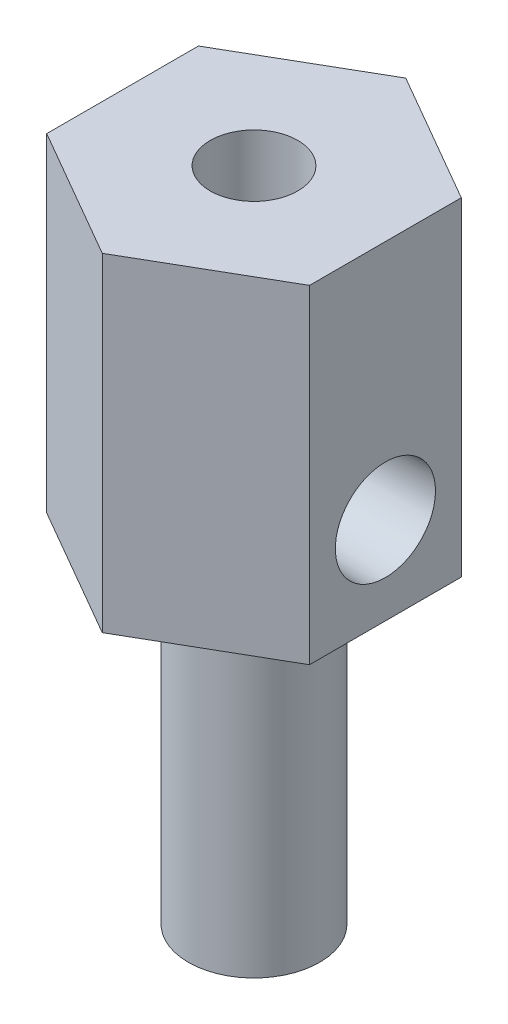
ISO-10303-21;
HEADER;
FILE_DESCRIPTION(('STEP AP214'),'2;1');
FILE_NAME('part.step','',(''),(''),'','','');
FILE_SCHEMA(('AUTOMOTIVE_DESIGN { 1 0 10303 214 1 1 1 1 }'));
ENDSEC;
DATA;
#1=APPLICATION_CONTEXT('core data for automotive mechanical design processes');
#2=APPLICATION_PROTOCOL_DEFINITION('international standard','automotive_design',2000,#1);
#3=PRODUCT_CONTEXT('',#1,'mechanical');
#4=PRODUCT('Part','Part','',(#3));
#5=PRODUCT_RELATED_PRODUCT_CATEGORY('part','',(#4));
#6=PRODUCT_DEFINITION_FORMATION('','',#4);
#7=PRODUCT_DEFINITION_CONTEXT('part definition',#1,'design');
#8=PRODUCT_DEFINITION('design','',#6,#7);
#9=PRODUCT_DEFINITION_SHAPE('','',#8);
#10=(LENGTH_UNIT() NAMED_UNIT(*) SI_UNIT(.MILLI.,.METRE.));
#11=(NAMED_UNIT(*) PLANE_ANGLE_UNIT() SI_UNIT($,.RADIAN.));
#12=(NAMED_UNIT(*) SI_UNIT($,.STERADIAN.) SOLID_ANGLE_UNIT());
#13=UNCERTAINTY_MEASURE_WITH_UNIT(LENGTH_MEASURE(1.E-05),#10,'distance_accuracy_value','');
#14=(GEOMETRIC_REPRESENTATION_CONTEXT(3) GLOBAL_UNCERTAINTY_ASSIGNED_CONTEXT((#13)) GLOBAL_UNIT_ASSIGNED_CONTEXT((#10,
#11,#12)) REPRESENTATION_CONTEXT('',''));
#15=CARTESIAN_POINT('',(0.,0.,0.));
#16=DIRECTION('',(0.,0.,1.));
#17=DIRECTION('',(1.,0.,0.));
#18=AXIS2_PLACEMENT_3D('',#15,#16,#17);
#19=CARTESIAN_POINT('',(0.,30.,0.));
#20=DIRECTION('',(0.,-1.,0.));
#21=DIRECTION('',(0.,0.,-1.));
#22=AXIS2_PLACEMENT_3D('',#19,#20,#21);
#23=CYLINDRICAL_SURFACE('',#22,6.);
#24=CARTESIAN_POINT('',(0.,30.,0.));
#25=DIRECTION('',(0.,1.,0.));
#26=DIRECTION('',(0.,0.,1.));
#27=AXIS2_PLACEMENT_3D('',#24,#25,#26);
#28=CIRCLE('',#27,6.);
#29=CARTESIAN_POINT('',(0.,30.,6.));
#30=VERTEX_POINT('',#29);
#31=EDGE_CURVE('E11',#30,#30,#28,.T.);
#32=ORIENTED_EDGE('',*,*,#31,.F.);
#33=EDGE_LOOP('',(#32));
#34=FACE_BOUND('',#33,.T.);
#35=CARTESIAN_POINT('',(0.,0.,0.));
#36=DIRECTION('',(0.,1.,0.));
#37=DIRECTION('',(0.,0.,1.));
#38=AXIS2_PLACEMENT_3D('',#35,#36,#37);
#39=CIRCLE('',#38,6.);
#40=CARTESIAN_POINT('',(0.,0.,6.));
#41=VERTEX_POINT('',#40);
#42=EDGE_CURVE('E20',#41,#41,#39,.T.);
#43=ORIENTED_EDGE('',*,*,#42,.T.);
#44=EDGE_LOOP('',(#43));
#45=FACE_BOUND('',#44,.T.);
#46=ADVANCED_FACE('F17',(#34,#45),#23,.T.);
#47=CARTESIAN_POINT('',(0.,0.,0.));
#48=DIRECTION('',(0.,1.,0.));
#49=DIRECTION('',(0.,0.,1.));
#50=AXIS2_PLACEMENT_3D('',#47,#48,#49);
#51=PLANE('',#50);
#52=ORIENTED_EDGE('',*,*,#42,.F.);
#53=EDGE_LOOP('',(#52));
#54=FACE_BOUND('',#53,.T.);
#55=ADVANCED_FACE('F129',(#54),#51,.F.);
#56=CARTESIAN_POINT('',(0.,30.,0.));
#57=DIRECTION('',(0.,1.,0.));
#58=DIRECTION('',(0.,0.,1.));
#59=AXIS2_PLACEMENT_3D('',#56,#57,#58);
#60=PLANE('',#59);
#61=DIRECTION('',(-0.866025403784439,0.,-0.5));
#62=VECTOR('',#61,1.);
#63=CARTESIAN_POINT('',(12.,30.,-6.92820323027551));
#64=LINE('',#63,#62);
#65=CARTESIAN_POINT('',(12.,30.,-6.92820323027551));
#66=VERTEX_POINT('',#65);
#67=CARTESIAN_POINT('',(0.,30.,-13.856406460551));
#68=VERTEX_POINT('',#67);
#69=EDGE_CURVE('E105',#66,#68,#64,.T.);
#70=ORIENTED_EDGE('',*,*,#69,.F.);
#71=DIRECTION('',(0.,0.,-1.));
#72=VECTOR('',#71,1.);
#73=CARTESIAN_POINT('',(12.,30.,6.92820323027552));
#74=LINE('',#73,#72);
#75=CARTESIAN_POINT('',(12.,30.,6.92820323027552));
#76=VERTEX_POINT('',#75);
#77=EDGE_CURVE('E63',#76,#66,#74,.T.);
#78=ORIENTED_EDGE('',*,*,#77,.F.);
#79=DIRECTION('',(0.866025403784439,0.,-0.5));
#80=VECTOR('',#79,1.);
#81=CARTESIAN_POINT('',(0.,30.,13.856406460551));
#82=LINE('',#81,#80);
#83=CARTESIAN_POINT('',(0.,30.,13.856406460551));
#84=VERTEX_POINT('',#83);
#85=EDGE_CURVE('E57',#84,#76,#82,.T.);
#86=ORIENTED_EDGE('',*,*,#85,.F.);
#87=DIRECTION('',(0.866025403784439,0.,0.5));
#88=VECTOR('',#87,1.);
#89=CARTESIAN_POINT('',(-12.,30.,6.92820323027551));
#90=LINE('',#89,#88);
#91=CARTESIAN_POINT('',(-12.,30.,6.92820323027551));
#92=VERTEX_POINT('',#91);
#93=EDGE_CURVE('E95',#92,#84,#90,.T.);
#94=ORIENTED_EDGE('',*,*,#93,.F.);
#95=DIRECTION('',(0.,0.,1.));
#96=VECTOR('',#95,1.);
#97=CARTESIAN_POINT('',(-12.,30.,-6.92820323027551));
#98=LINE('',#97,#96);
#99=CARTESIAN_POINT('',(-12.,30.,-6.92820323027551));
#100=VERTEX_POINT('',#99);
#101=EDGE_CURVE('E111',#100,#92,#98,.T.);
#102=ORIENTED_EDGE('',*,*,#101,.F.);
#103=DIRECTION('',(-0.866025403784439,0.,0.5));
#104=VECTOR('',#103,1.);
#105=CARTESIAN_POINT('',(0.,30.,-13.856406460551));
#106=LINE('',#105,#104);
#107=EDGE_CURVE('E108',#68,#100,#106,.T.);
#108=ORIENTED_EDGE('',*,*,#107,.F.);
#109=EDGE_LOOP('',(#70,#78,#86,#94,#102,#108));
#110=FACE_BOUND('',#109,.T.);
#111=ORIENTED_EDGE('',*,*,#31,.T.);
#112=EDGE_LOOP('',(#111));
#113=FACE_BOUND('',#112,.T.);
#114=ADVANCED_FACE('F131',(#110,#113),#60,.F.);
#115=CARTESIAN_POINT('',(12.,60.,-6.92820323027551));
#116=DIRECTION('',(-0.5,0.,0.866025403784439));
#117=DIRECTION('',(0.866025403784439,0.,0.5));
#118=AXIS2_PLACEMENT_3D('',#115,#116,#117);
#119=PLANE('',#118);
#120=ORIENTED_EDGE('',*,*,#69,.T.);
#121=DIRECTION('',(0.,-1.,0.));
#122=VECTOR('',#121,1.);
#123=CARTESIAN_POINT('',(0.,60.,-13.856406460551));
#124=LINE('',#123,#122);
#125=CARTESIAN_POINT('',(0.,60.,-13.856406460551));
#126=VERTEX_POINT('',#125);
#127=EDGE_CURVE('E123',#126,#68,#124,.T.);
#128=ORIENTED_EDGE('',*,*,#127,.F.);
#129=DIRECTION('',(-0.866025403784439,0.,-0.5));
#130=VECTOR('',#129,1.);
#131=CARTESIAN_POINT('',(12.,60.,-6.92820323027551));
#132=LINE('',#131,#130);
#133=CARTESIAN_POINT('',(12.,60.,-6.92820323027551));
#134=VERTEX_POINT('',#133);
#135=EDGE_CURVE('E116',#134,#126,#132,.T.);
#136=ORIENTED_EDGE('',*,*,#135,.F.);
#137=DIRECTION('',(0.,-1.,0.));
#138=VECTOR('',#137,1.);
#139=CARTESIAN_POINT('',(12.,60.,-6.92820323027551));
#140=LINE('',#139,#138);
#141=EDGE_CURVE('E101',#134,#66,#140,.T.);
#142=ORIENTED_EDGE('',*,*,#141,.T.);
#143=EDGE_LOOP('',(#120,#128,#136,#142));
#144=FACE_BOUND('',#143,.T.);
#145=ADVANCED_FACE('F138',(#144),#119,.F.);
#146=CARTESIAN_POINT('',(0.,60.,-13.856406460551));
#147=DIRECTION('',(0.5,0.,0.866025403784439));
#148=DIRECTION('',(0.866025403784439,0.,-0.5));
#149=AXIS2_PLACEMENT_3D('',#146,#147,#148);
#150=PLANE('',#149);
#151=ORIENTED_EDGE('',*,*,#107,.T.);
#152=DIRECTION('',(0.,-1.,0.));
#153=VECTOR('',#152,1.);
#154=CARTESIAN_POINT('',(-12.,60.,-6.92820323027551));
#155=LINE('',#154,#153);
#156=CARTESIAN_POINT('',(-12.,60.,-6.92820323027551));
#157=VERTEX_POINT('',#156);
#158=EDGE_CURVE('E120',#157,#100,#155,.T.);
#159=ORIENTED_EDGE('',*,*,#158,.F.);
#160=DIRECTION('',(-0.866025403784439,0.,0.5));
#161=VECTOR('',#160,1.);
#162=CARTESIAN_POINT('',(0.,60.,-13.856406460551));
#163=LINE('',#162,#161);
#164=EDGE_CURVE('E72',#126,#157,#163,.T.);
#165=ORIENTED_EDGE('',*,*,#164,.F.);
#166=ORIENTED_EDGE('',*,*,#127,.T.);
#167=EDGE_LOOP('',(#151,#159,#165,#166));
#168=FACE_BOUND('',#167,.T.);
#169=ADVANCED_FACE('F145',(#168),#150,.F.);
#170=CARTESIAN_POINT('',(-12.,60.,-6.92820323027551));
#171=DIRECTION('',(1.,0.,0.));
#172=DIRECTION('',(0.,0.,-1.));
#173=AXIS2_PLACEMENT_3D('',#170,#171,#172);
#174=PLANE('',#173);
#175=ORIENTED_EDGE('',*,*,#101,.T.);
#176=DIRECTION('',(0.,-1.,0.));
#177=VECTOR('',#176,1.);
#178=CARTESIAN_POINT('',(-12.,60.,6.92820323027551));
#179=LINE('',#178,#177);
#180=CARTESIAN_POINT('',(-12.,60.,6.92820323027551));
#181=VERTEX_POINT('',#180);
#182=EDGE_CURVE('E96',#181,#92,#179,.T.);
#183=ORIENTED_EDGE('',*,*,#182,.F.);
#184=DIRECTION('',(0.,0.,1.));
#185=VECTOR('',#184,1.);
#186=CARTESIAN_POINT('',(-12.,60.,-6.92820323027551));
#187=LINE('',#186,#185);
#188=EDGE_CURVE('E87',#157,#181,#187,.T.);
#189=ORIENTED_EDGE('',*,*,#188,.F.);
#190=ORIENTED_EDGE('',*,*,#158,.T.);
#191=EDGE_LOOP('',(#175,#183,#189,#190));
#192=FACE_BOUND('',#191,.T.);
#193=ADVANCED_FACE('F149',(#192),#174,.F.);
#194=CARTESIAN_POINT('',(-12.,60.,6.92820323027551));
#195=DIRECTION('',(0.5,0.,-0.866025403784439));
#196=DIRECTION('',(-0.866025403784439,0.,-0.5));
#197=AXIS2_PLACEMENT_3D('',#194,#195,#196);
#198=PLANE('',#197);
#199=ORIENTED_EDGE('',*,*,#93,.T.);
#200=DIRECTION('',(0.,-1.,0.));
#201=VECTOR('',#200,1.);
#202=CARTESIAN_POINT('',(0.,60.,13.856406460551));
#203=LINE('',#202,#201);
#204=CARTESIAN_POINT('',(0.,60.,13.856406460551));
#205=VERTEX_POINT('',#204);
#206=EDGE_CURVE('E92',#205,#84,#203,.T.);
#207=ORIENTED_EDGE('',*,*,#206,.F.);
#208=DIRECTION('',(0.866025403784439,0.,0.5));
#209=VECTOR('',#208,1.);
#210=CARTESIAN_POINT('',(-12.,60.,6.92820323027551));
#211=LINE('',#210,#209);
#212=EDGE_CURVE('E81',#181,#205,#211,.T.);
#213=ORIENTED_EDGE('',*,*,#212,.F.);
#214=ORIENTED_EDGE('',*,*,#182,.T.);
#215=EDGE_LOOP('',(#199,#207,#213,#214));
#216=FACE_BOUND('',#215,.T.);
#217=ADVANCED_FACE('F93',(#216),#198,.F.);
#218=CARTESIAN_POINT('',(0.,60.,13.856406460551));
#219=DIRECTION('',(-0.5,0.,-0.866025403784439));
#220=DIRECTION('',(-0.866025403784439,0.,0.5));
#221=AXIS2_PLACEMENT_3D('',#218,#219,#220);
#222=PLANE('',#221);
#223=ORIENTED_EDGE('',*,*,#85,.T.);
#224=DIRECTION('',(0.,-1.,0.));
#225=VECTOR('',#224,1.);
#226=CARTESIAN_POINT('',(12.,60.,6.92820323027552));
#227=LINE('',#226,#225);
#228=CARTESIAN_POINT('',(12.,60.,6.92820323027552));
#229=VERTEX_POINT('',#228);
#230=EDGE_CURVE('E97',#229,#76,#227,.T.);
#231=ORIENTED_EDGE('',*,*,#230,.F.);
#232=DIRECTION('',(0.866025403784439,0.,-0.5));
#233=VECTOR('',#232,1.);
#234=CARTESIAN_POINT('',(0.,60.,13.856406460551));
#235=LINE('',#234,#233);
#236=EDGE_CURVE('E85',#205,#229,#235,.T.);
#237=ORIENTED_EDGE('',*,*,#236,.F.);
#238=ORIENTED_EDGE('',*,*,#206,.T.);
#239=EDGE_LOOP('',(#223,#231,#237,#238));
#240=FACE_BOUND('',#239,.T.);
#241=ADVANCED_FACE('F99',(#240),#222,.F.);
#242=CARTESIAN_POINT('',(12.,60.,6.92820323027552));
#243=DIRECTION('',(-1.,0.,0.));
#244=DIRECTION('',(0.,0.,1.));
#245=AXIS2_PLACEMENT_3D('',#242,#243,#244);
#246=PLANE('',#245);
#247=CARTESIAN_POINT('',(12.,38.,0.));
#248=DIRECTION('',(1.,0.,0.));
#249=DIRECTION('',(0.,0.,-1.));
#250=AXIS2_PLACEMENT_3D('',#247,#248,#249);
#251=CIRCLE('',#250,4.5735);
#252=CARTESIAN_POINT('',(12.,38.,-4.5735));
#253=VERTEX_POINT('',#252);
#254=EDGE_CURVE('E204',#253,#253,#251,.T.);
#255=ORIENTED_EDGE('',*,*,#254,.F.);
#256=EDGE_LOOP('',(#255));
#257=FACE_BOUND('',#256,.T.);
#258=ORIENTED_EDGE('',*,*,#77,.T.);
#259=ORIENTED_EDGE('',*,*,#141,.F.);
#260=DIRECTION('',(0.,0.,-1.));
#261=VECTOR('',#260,1.);
#262=CARTESIAN_POINT('',(12.,60.,6.92820323027552));
#263=LINE('',#262,#261);
#264=EDGE_CURVE('E33',#229,#134,#263,.T.);
#265=ORIENTED_EDGE('',*,*,#264,.F.);
#266=ORIENTED_EDGE('',*,*,#230,.T.);
#267=EDGE_LOOP('',(#258,#259,#265,#266));
#268=FACE_BOUND('',#267,.T.);
#269=ADVANCED_FACE('F157',(#257,#268),#246,.F.);
#270=CARTESIAN_POINT('',(0.,60.,0.));
#271=DIRECTION('',(0.,1.,0.));
#272=DIRECTION('',(0.,0.,1.));
#273=AXIS2_PLACEMENT_3D('',#270,#271,#272);
#274=PLANE('',#273);
#275=CARTESIAN_POINT('',(0.,60.,0.));
#276=DIRECTION('',(0.,1.,0.));
#277=DIRECTION('',(0.,0.,1.));
#278=AXIS2_PLACEMENT_3D('',#275,#276,#277);
#279=CIRCLE('',#278,4.);
#280=CARTESIAN_POINT('',(0.,60.,4.));
#281=VERTEX_POINT('',#280);
#282=EDGE_CURVE('E214',#281,#281,#279,.T.);
#283=ORIENTED_EDGE('',*,*,#282,.F.);
#284=EDGE_LOOP('',(#283));
#285=FACE_BOUND('',#284,.T.);
#286=ORIENTED_EDGE('',*,*,#135,.T.);
#287=ORIENTED_EDGE('',*,*,#164,.T.);
#288=ORIENTED_EDGE('',*,*,#188,.T.);
#289=ORIENTED_EDGE('',*,*,#212,.T.);
#290=ORIENTED_EDGE('',*,*,#236,.T.);
#291=ORIENTED_EDGE('',*,*,#264,.T.);
#292=EDGE_LOOP('',(#286,#287,#288,#289,#290,#291));
#293=FACE_BOUND('',#292,.T.);
#294=ADVANCED_FACE('F83',(#285,#293),#274,.T.);
#295=CARTESIAN_POINT('',(0.,50.,0.));
#296=DIRECTION('',(0.,1.,0.));
#297=DIRECTION('',(0.,0.,1.));
#298=AXIS2_PLACEMENT_3D('',#295,#296,#297);
#299=CONICAL_SURFACE('',#298,3.4,1.02974425867665);
#300=CARTESIAN_POINT('',(0.,47.9570738953063,0.));
#301=VERTEX_POINT('',#300);
#302=VERTEX_LOOP('',#301);
#303=FACE_BOUND('',#302,.T.);
#304=CARTESIAN_POINT('',(0.,50.,0.));
#305=DIRECTION('',(0.,1.,0.));
#306=DIRECTION('',(0.,0.,1.));
#307=AXIS2_PLACEMENT_3D('',#304,#305,#306);
#308=CIRCLE('',#307,3.4);
#309=CARTESIAN_POINT('',(0.,50.,3.4));
#310=VERTEX_POINT('',#309);
#311=EDGE_CURVE('E109',#310,#310,#308,.T.);
#312=ORIENTED_EDGE('',*,*,#311,.T.);
#313=EDGE_LOOP('',(#312));
#314=FACE_BOUND('',#313,.T.);
#315=ADVANCED_FACE('F163',(#303,#314),#299,.F.);
#316=CARTESIAN_POINT('',(0.,60.,0.));
#317=DIRECTION('',(0.,1.,0.));
#318=DIRECTION('',(0.,0.,1.));
#319=AXIS2_PLACEMENT_3D('',#316,#317,#318);
#320=CYLINDRICAL_SURFACE('',#319,3.4);
#321=ORIENTED_EDGE('',*,*,#311,.F.);
#322=EDGE_LOOP('',(#321));
#323=FACE_BOUND('',#322,.T.);
#324=CARTESIAN_POINT('',(0.,44.,0.));
#325=DIRECTION('',(0.,1.,0.));
#326=DIRECTION('',(0.,0.,1.));
#327=AXIS2_PLACEMENT_3D('',#324,#325,#326);
#328=CIRCLE('',#327,3.4);
#329=CARTESIAN_POINT('',(0.,44.,3.4));
#330=VERTEX_POINT('',#329);
#331=EDGE_CURVE('E220',#330,#330,#328,.T.);
#332=ORIENTED_EDGE('',*,*,#331,.T.);
#333=EDGE_LOOP('',(#332));
#334=FACE_BOUND('',#333,.T.);
#335=ADVANCED_FACE('F167',(#323,#334),#320,.T.);
#336=CARTESIAN_POINT('',(3.4,44.,0.));
#337=DIRECTION('',(0.,-1.,0.));
#338=DIRECTION('',(0.,0.,-1.));
#339=AXIS2_PLACEMENT_3D('',#336,#337,#338);
#340=PLANE('',#339);
#341=ORIENTED_EDGE('',*,*,#331,.F.);
#342=EDGE_LOOP('',(#341));
#343=FACE_BOUND('',#342,.T.);
#344=CARTESIAN_POINT('',(0.,44.,0.));
#345=DIRECTION('',(0.,1.,0.));
#346=DIRECTION('',(0.,0.,1.));
#347=AXIS2_PLACEMENT_3D('',#344,#345,#346);
#348=CIRCLE('',#347,4.);
#349=CARTESIAN_POINT('',(0.,44.,4.));
#350=VERTEX_POINT('',#349);
#351=EDGE_CURVE('E217',#350,#350,#348,.T.);
#352=ORIENTED_EDGE('',*,*,#351,.T.);
#353=EDGE_LOOP('',(#352));
#354=FACE_BOUND('',#353,.T.);
#355=ADVANCED_FACE('F171',(#343,#354),#340,.F.);
#356=CARTESIAN_POINT('',(0.,60.,0.));
#357=DIRECTION('',(0.,1.,0.));
#358=DIRECTION('',(0.,0.,1.));
#359=AXIS2_PLACEMENT_3D('',#356,#357,#358);
#360=CYLINDRICAL_SURFACE('',#359,4.);
#361=ORIENTED_EDGE('',*,*,#351,.F.);
#362=EDGE_LOOP('',(#361));
#363=FACE_BOUND('',#362,.T.);
#364=ORIENTED_EDGE('',*,*,#282,.T.);
#365=EDGE_LOOP('',(#364));
#366=FACE_BOUND('',#365,.T.);
#367=ADVANCED_FACE('F175',(#363,#366),#360,.F.);
#368=CARTESIAN_POINT('',(0.0600000000000028,38.,0.));
#369=DIRECTION('',(1.,0.,0.));
#370=DIRECTION('',(0.,0.,-1.));
#371=AXIS2_PLACEMENT_3D('',#368,#369,#370);
#372=CONICAL_SURFACE('',#371,3.95,1.02974425867665);
#373=CARTESIAN_POINT('',(-2.31339944515886,38.,0.));
#374=VERTEX_POINT('',#373);
#375=VERTEX_LOOP('',#374);
#376=FACE_BOUND('',#375,.T.);
#377=CARTESIAN_POINT('',(0.0600000000000028,38.,0.));
#378=DIRECTION('',(1.,0.,0.));
#379=DIRECTION('',(0.,0.,-1.));
#380=AXIS2_PLACEMENT_3D('',#377,#378,#379);
#381=CIRCLE('',#380,3.95);
#382=CARTESIAN_POINT('',(0.0600000000000028,38.,-3.95));
#383=VERTEX_POINT('',#382);
#384=EDGE_CURVE('E211',#383,#383,#381,.T.);
#385=ORIENTED_EDGE('',*,*,#384,.T.);
#386=EDGE_LOOP('',(#385));
#387=FACE_BOUND('',#386,.T.);
#388=ADVANCED_FACE('F179',(#376,#387),#372,.F.);
#389=CARTESIAN_POINT('',(12.,38.,0.));
#390=DIRECTION('',(1.,0.,0.));
#391=DIRECTION('',(0.,0.,-1.));
#392=AXIS2_PLACEMENT_3D('',#389,#390,#391);
#393=CYLINDRICAL_SURFACE('',#392,3.95);
#394=ORIENTED_EDGE('',*,*,#384,.F.);
#395=EDGE_LOOP('',(#394));
#396=FACE_BOUND('',#395,.T.);
#397=CARTESIAN_POINT('',(4.6,38.,0.));
#398=DIRECTION('',(1.,0.,0.));
#399=DIRECTION('',(0.,0.,-1.));
#400=AXIS2_PLACEMENT_3D('',#397,#398,#399);
#401=CIRCLE('',#400,3.95);
#402=CARTESIAN_POINT('',(4.6,38.,-3.95));
#403=VERTEX_POINT('',#402);
#404=EDGE_CURVE('E206',#403,#403,#401,.T.);
#405=ORIENTED_EDGE('',*,*,#404,.T.);
#406=EDGE_LOOP('',(#405));
#407=FACE_BOUND('',#406,.T.);
#408=ADVANCED_FACE('F183',(#396,#407),#393,.F.);
#409=CARTESIAN_POINT('',(4.6,41.95,0.));
#410=DIRECTION('',(-1.,0.,0.));
#411=DIRECTION('',(0.,0.,1.));
#412=AXIS2_PLACEMENT_3D('',#409,#410,#411);
#413=PLANE('',#412);
#414=ORIENTED_EDGE('',*,*,#404,.F.);
#415=EDGE_LOOP('',(#414));
#416=FACE_BOUND('',#415,.T.);
#417=CARTESIAN_POINT('',(4.6,38.,0.));
#418=DIRECTION('',(1.,0.,0.));
#419=DIRECTION('',(0.,0.,-1.));
#420=AXIS2_PLACEMENT_3D('',#417,#418,#419);
#421=CIRCLE('',#420,4.34249700411669);
#422=CARTESIAN_POINT('',(4.6,38.,-4.34249700411669));
#423=VERTEX_POINT('',#422);
#424=EDGE_CURVE('E201',#423,#423,#421,.T.);
#425=ORIENTED_EDGE('',*,*,#424,.T.);
#426=EDGE_LOOP('',(#425));
#427=FACE_BOUND('',#426,.T.);
#428=ADVANCED_FACE('F187',(#416,#427),#413,.F.);
#429=CARTESIAN_POINT('',(12.,38.,0.));
#430=DIRECTION('',(1.,0.,0.));
#431=DIRECTION('',(0.,0.,-1.));
#432=AXIS2_PLACEMENT_3D('',#429,#430,#431);
#433=CONICAL_SURFACE('',#432,4.5735,0.0312064870256583);
#434=ORIENTED_EDGE('',*,*,#424,.F.);
#435=EDGE_LOOP('',(#434));
#436=FACE_BOUND('',#435,.T.);
#437=ORIENTED_EDGE('',*,*,#254,.T.);
#438=EDGE_LOOP('',(#437));
#439=FACE_BOUND('',#438,.T.);
#440=ADVANCED_FACE('F191',(#436,#439),#433,.F.);
#441=CLOSED_SHELL('',(#46,#55,#114,#145,#169,#193,#217,#241,#269,#294,#315,#335,#355,#367,#388,
#408,#428,#440));
#442=MANIFOLD_SOLID_BREP('B1',#441);
#443=ADVANCED_BREP_SHAPE_REPRESENTATION('',(#18,#442),#14);
#444=SHAPE_DEFINITION_REPRESENTATION(#9,#443);
ENDSEC;
END-ISO-10303-21;
